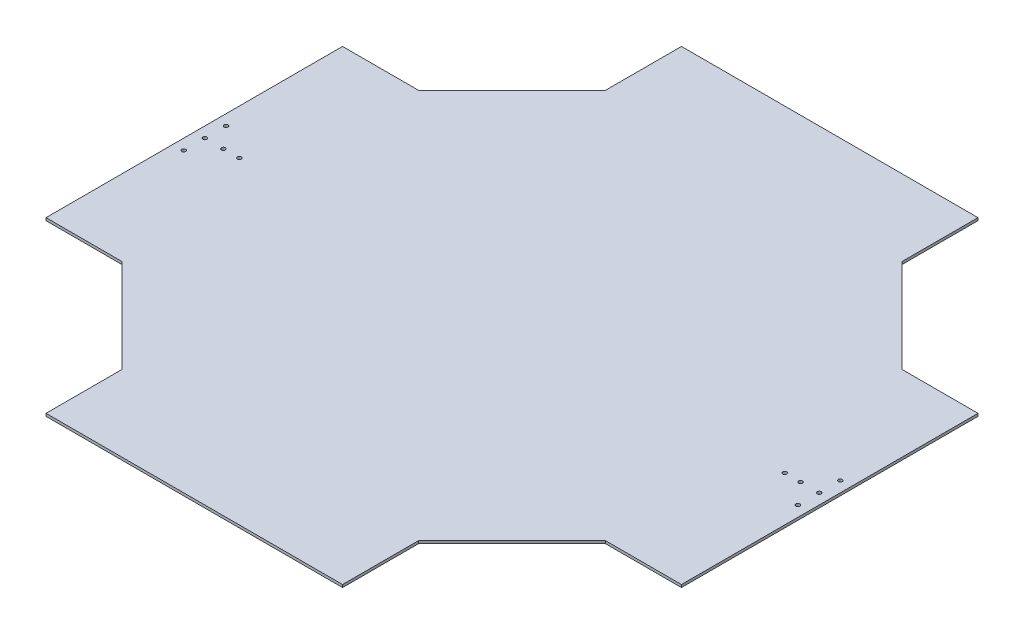
ISO-10303-21;
HEADER;
FILE_DESCRIPTION(('STEP AP214'),'2;1');
FILE_NAME('part.step','',(''),(''),'','','');
FILE_SCHEMA(('AUTOMOTIVE_DESIGN { 1 0 10303 214 1 1 1 1 }'));
ENDSEC;
DATA;
#1=APPLICATION_CONTEXT('core data for automotive mechanical design processes');
#2=APPLICATION_PROTOCOL_DEFINITION('international standard','automotive_design',2000,#1);
#3=PRODUCT_CONTEXT('',#1,'mechanical');
#4=PRODUCT('Part','Part','',(#3));
#5=PRODUCT_RELATED_PRODUCT_CATEGORY('part','',(#4));
#6=PRODUCT_DEFINITION_FORMATION('','',#4);
#7=PRODUCT_DEFINITION_CONTEXT('part definition',#1,'design');
#8=PRODUCT_DEFINITION('design','',#6,#7);
#9=PRODUCT_DEFINITION_SHAPE('','',#8);
#10=(LENGTH_UNIT() NAMED_UNIT(*) SI_UNIT(.MILLI.,.METRE.));
#11=(NAMED_UNIT(*) PLANE_ANGLE_UNIT() SI_UNIT($,.RADIAN.));
#12=(NAMED_UNIT(*) SI_UNIT($,.STERADIAN.) SOLID_ANGLE_UNIT());
#13=UNCERTAINTY_MEASURE_WITH_UNIT(LENGTH_MEASURE(1.E-05),#10,'distance_accuracy_value','');
#14=(GEOMETRIC_REPRESENTATION_CONTEXT(3) GLOBAL_UNCERTAINTY_ASSIGNED_CONTEXT((#13)) GLOBAL_UNIT_ASSIGNED_CONTEXT((#10,
#11,#12)) REPRESENTATION_CONTEXT('',''));
#15=CARTESIAN_POINT('',(0.,0.,0.));
#16=DIRECTION('',(0.,0.,1.));
#17=DIRECTION('',(1.,0.,0.));
#18=AXIS2_PLACEMENT_3D('',#15,#16,#17);
#19=CARTESIAN_POINT('',(-381.,1.5875,177.8));
#20=DIRECTION('',(1.,0.,0.));
#21=DIRECTION('',(0.,0.,-1.));
#22=AXIS2_PLACEMENT_3D('',#19,#20,#21);
#23=PLANE('',#22);
#24=DIRECTION('',(0.,0.,1.));
#25=VECTOR('',#24,1.);
#26=CARTESIAN_POINT('',(-381.,-1.5875,177.8));
#27=LINE('',#26,#25);
#28=CARTESIAN_POINT('',(-381.,-1.5875,-177.8));
#29=VERTEX_POINT('',#28);
#30=CARTESIAN_POINT('',(-381.,-1.5875,177.8));
#31=VERTEX_POINT('',#30);
#32=EDGE_CURVE('E181',#29,#31,#27,.T.);
#33=ORIENTED_EDGE('',*,*,#32,.T.);
#34=DIRECTION('',(0.,-1.,0.));
#35=VECTOR('',#34,1.);
#36=CARTESIAN_POINT('',(-381.,1.5875,177.8));
#37=LINE('',#36,#35);
#38=CARTESIAN_POINT('',(-381.,1.5875,177.8));
#39=VERTEX_POINT('',#38);
#40=EDGE_CURVE('E11',#39,#31,#37,.T.);
#41=ORIENTED_EDGE('',*,*,#40,.F.);
#42=DIRECTION('',(0.,0.,1.));
#43=VECTOR('',#42,1.);
#44=CARTESIAN_POINT('',(-381.,1.5875,177.8));
#45=LINE('',#44,#43);
#46=CARTESIAN_POINT('',(-381.,1.5875,-177.8));
#47=VERTEX_POINT('',#46);
#48=EDGE_CURVE('E212',#47,#39,#45,.T.);
#49=ORIENTED_EDGE('',*,*,#48,.F.);
#50=DIRECTION('',(0.,-1.,0.));
#51=VECTOR('',#50,1.);
#52=CARTESIAN_POINT('',(-381.,1.5875,-177.8));
#53=LINE('',#52,#51);
#54=EDGE_CURVE('E177',#47,#29,#53,.T.);
#55=ORIENTED_EDGE('',*,*,#54,.T.);
#56=EDGE_LOOP('',(#33,#41,#49,#55));
#57=FACE_BOUND('',#56,.T.);
#58=ADVANCED_FACE('F37',(#57),#23,.F.);
#59=CARTESIAN_POINT('',(-381.,1.5875,177.8));
#60=DIRECTION('',(0.,0.,-1.));
#61=DIRECTION('',(-1.,0.,0.));
#62=AXIS2_PLACEMENT_3D('',#59,#60,#61);
#63=PLANE('',#62);
#64=DIRECTION('',(1.,0.,0.));
#65=VECTOR('',#64,1.);
#66=CARTESIAN_POINT('',(-381.,-1.5875,177.8));
#67=LINE('',#66,#65);
#68=CARTESIAN_POINT('',(-289.71875,-1.5875,177.8));
#69=VERTEX_POINT('',#68);
#70=EDGE_CURVE('E184',#31,#69,#67,.T.);
#71=ORIENTED_EDGE('',*,*,#70,.T.);
#72=DIRECTION('',(0.,-1.,0.));
#73=VECTOR('',#72,1.);
#74=CARTESIAN_POINT('',(-289.71875,1.5875,177.8));
#75=LINE('',#74,#73);
#76=CARTESIAN_POINT('',(-289.71875,1.5875,177.8));
#77=VERTEX_POINT('',#76);
#78=EDGE_CURVE('E45',#77,#69,#75,.T.);
#79=ORIENTED_EDGE('',*,*,#78,.F.);
#80=DIRECTION('',(1.,0.,0.));
#81=VECTOR('',#80,1.);
#82=CARTESIAN_POINT('',(-381.,1.5875,177.8));
#83=LINE('',#82,#81);
#84=EDGE_CURVE('E120',#39,#77,#83,.T.);
#85=ORIENTED_EDGE('',*,*,#84,.F.);
#86=ORIENTED_EDGE('',*,*,#40,.T.);
#87=EDGE_LOOP('',(#71,#79,#85,#86));
#88=FACE_BOUND('',#87,.T.);
#89=ADVANCED_FACE('F312',(#88),#63,.F.);
#90=CARTESIAN_POINT('',(-289.71875,1.5875,177.8));
#91=DIRECTION('',(0.707106781186549,0.,-0.707106781186545));
#92=DIRECTION('',(-0.707106781186546,0.,-0.70710678118655));
#93=AXIS2_PLACEMENT_3D('',#90,#91,#92);
#94=PLANE('',#93);
#95=DIRECTION('',(0.707106781186546,0.,0.707106781186549));
#96=VECTOR('',#95,1.);
#97=CARTESIAN_POINT('',(-289.71875,-1.5875,177.8));
#98=LINE('',#97,#96);
#99=CARTESIAN_POINT('',(-177.8,-1.5875,289.718750000001));
#100=VERTEX_POINT('',#99);
#101=EDGE_CURVE('E187',#69,#100,#98,.T.);
#102=ORIENTED_EDGE('',*,*,#101,.T.);
#103=DIRECTION('',(0.,-1.,0.));
#104=VECTOR('',#103,1.);
#105=CARTESIAN_POINT('',(-177.8,1.5875,289.718750000001));
#106=LINE('',#105,#104);
#107=CARTESIAN_POINT('',(-177.8,1.5875,289.718750000001));
#108=VERTEX_POINT('',#107);
#109=EDGE_CURVE('E243',#108,#100,#106,.T.);
#110=ORIENTED_EDGE('',*,*,#109,.F.);
#111=DIRECTION('',(0.707106781186546,0.,0.707106781186549));
#112=VECTOR('',#111,1.);
#113=CARTESIAN_POINT('',(-289.71875,1.5875,177.8));
#114=LINE('',#113,#112);
#115=EDGE_CURVE('E251',#77,#108,#114,.T.);
#116=ORIENTED_EDGE('',*,*,#115,.F.);
#117=ORIENTED_EDGE('',*,*,#78,.T.);
#118=EDGE_LOOP('',(#102,#110,#116,#117));
#119=FACE_BOUND('',#118,.T.);
#120=ADVANCED_FACE('F249',(#119),#94,.F.);
#121=CARTESIAN_POINT('',(-177.8,1.5875,289.718750000001));
#122=DIRECTION('',(1.,0.,0.));
#123=DIRECTION('',(0.,0.,-1.));
#124=AXIS2_PLACEMENT_3D('',#121,#122,#123);
#125=PLANE('',#124);
#126=DIRECTION('',(0.,0.,1.));
#127=VECTOR('',#126,1.);
#128=CARTESIAN_POINT('',(-177.8,-1.5875,289.718750000001));
#129=LINE('',#128,#127);
#130=CARTESIAN_POINT('',(-177.8,-1.5875,381.));
#131=VERTEX_POINT('',#130);
#132=EDGE_CURVE('E189',#100,#131,#129,.T.);
#133=ORIENTED_EDGE('',*,*,#132,.T.);
#134=DIRECTION('',(0.,-1.,0.));
#135=VECTOR('',#134,1.);
#136=CARTESIAN_POINT('',(-177.8,1.5875,381.));
#137=LINE('',#136,#135);
#138=CARTESIAN_POINT('',(-177.8,1.5875,381.));
#139=VERTEX_POINT('',#138);
#140=EDGE_CURVE('E240',#139,#131,#137,.T.);
#141=ORIENTED_EDGE('',*,*,#140,.F.);
#142=DIRECTION('',(0.,0.,1.));
#143=VECTOR('',#142,1.);
#144=CARTESIAN_POINT('',(-177.8,1.5875,289.718750000001));
#145=LINE('',#144,#143);
#146=EDGE_CURVE('E269',#108,#139,#145,.T.);
#147=ORIENTED_EDGE('',*,*,#146,.F.);
#148=ORIENTED_EDGE('',*,*,#109,.T.);
#149=EDGE_LOOP('',(#133,#141,#147,#148));
#150=FACE_BOUND('',#149,.T.);
#151=ADVANCED_FACE('F260',(#150),#125,.F.);
#152=CARTESIAN_POINT('',(-177.8,1.5875,381.));
#153=DIRECTION('',(0.,0.,-1.));
#154=DIRECTION('',(-1.,0.,0.));
#155=AXIS2_PLACEMENT_3D('',#152,#153,#154);
#156=PLANE('',#155);
#157=DIRECTION('',(1.,0.,0.));
#158=VECTOR('',#157,1.);
#159=CARTESIAN_POINT('',(-177.8,-1.5875,381.));
#160=LINE('',#159,#158);
#161=CARTESIAN_POINT('',(177.8,-1.5875,381.));
#162=VERTEX_POINT('',#161);
#163=EDGE_CURVE('E191',#131,#162,#160,.T.);
#164=ORIENTED_EDGE('',*,*,#163,.T.);
#165=DIRECTION('',(0.,-1.,0.));
#166=VECTOR('',#165,1.);
#167=CARTESIAN_POINT('',(177.8,1.5875,381.));
#168=LINE('',#167,#166);
#169=CARTESIAN_POINT('',(177.8,1.5875,381.));
#170=VERTEX_POINT('',#169);
#171=EDGE_CURVE('E237',#170,#162,#168,.T.);
#172=ORIENTED_EDGE('',*,*,#171,.F.);
#173=DIRECTION('',(1.,0.,0.));
#174=VECTOR('',#173,1.);
#175=CARTESIAN_POINT('',(-177.8,1.5875,381.));
#176=LINE('',#175,#174);
#177=EDGE_CURVE('E266',#139,#170,#176,.T.);
#178=ORIENTED_EDGE('',*,*,#177,.F.);
#179=ORIENTED_EDGE('',*,*,#140,.T.);
#180=EDGE_LOOP('',(#164,#172,#178,#179));
#181=FACE_BOUND('',#180,.T.);
#182=ADVANCED_FACE('F264',(#181),#156,.F.);
#183=CARTESIAN_POINT('',(177.8,1.5875,289.718750000001));
#184=DIRECTION('',(-1.,0.,0.));
#185=DIRECTION('',(0.,0.,1.));
#186=AXIS2_PLACEMENT_3D('',#183,#184,#185);
#187=PLANE('',#186);
#188=DIRECTION('',(0.,0.,-1.));
#189=VECTOR('',#188,1.);
#190=CARTESIAN_POINT('',(177.8,-1.5875,289.718750000001));
#191=LINE('',#190,#189);
#192=CARTESIAN_POINT('',(177.8,-1.5875,289.718750000001));
#193=VERTEX_POINT('',#192);
#194=EDGE_CURVE('E193',#162,#193,#191,.T.);
#195=ORIENTED_EDGE('',*,*,#194,.T.);
#196=DIRECTION('',(0.,-1.,0.));
#197=VECTOR('',#196,1.);
#198=CARTESIAN_POINT('',(177.8,1.5875,289.718750000001));
#199=LINE('',#198,#197);
#200=CARTESIAN_POINT('',(177.8,1.5875,289.718750000001));
#201=VERTEX_POINT('',#200);
#202=EDGE_CURVE('E234',#201,#193,#199,.T.);
#203=ORIENTED_EDGE('',*,*,#202,.F.);
#204=DIRECTION('',(0.,0.,-1.));
#205=VECTOR('',#204,1.);
#206=CARTESIAN_POINT('',(177.8,1.5875,289.718750000001));
#207=LINE('',#206,#205);
#208=EDGE_CURVE('E268',#170,#201,#207,.T.);
#209=ORIENTED_EDGE('',*,*,#208,.F.);
#210=ORIENTED_EDGE('',*,*,#171,.T.);
#211=EDGE_LOOP('',(#195,#203,#209,#210));
#212=FACE_BOUND('',#211,.T.);
#213=ADVANCED_FACE('F325',(#212),#187,.F.);
#214=CARTESIAN_POINT('',(289.71875,1.5875,177.8));
#215=DIRECTION('',(-0.70710678118655,0.,-0.707106781186545));
#216=DIRECTION('',(-0.707106781186545,0.,0.70710678118655));
#217=AXIS2_PLACEMENT_3D('',#214,#215,#216);
#218=PLANE('',#217);
#219=DIRECTION('',(0.707106781186545,0.,-0.70710678118655));
#220=VECTOR('',#219,1.);
#221=CARTESIAN_POINT('',(289.71875,-1.5875,177.8));
#222=LINE('',#221,#220);
#223=CARTESIAN_POINT('',(289.71875,-1.5875,177.8));
#224=VERTEX_POINT('',#223);
#225=EDGE_CURVE('E195',#193,#224,#222,.T.);
#226=ORIENTED_EDGE('',*,*,#225,.T.);
#227=DIRECTION('',(0.,-1.,0.));
#228=VECTOR('',#227,1.);
#229=CARTESIAN_POINT('',(289.71875,1.5875,177.8));
#230=LINE('',#229,#228);
#231=CARTESIAN_POINT('',(289.71875,1.5875,177.8));
#232=VERTEX_POINT('',#231);
#233=EDGE_CURVE('E231',#232,#224,#230,.T.);
#234=ORIENTED_EDGE('',*,*,#233,.F.);
#235=DIRECTION('',(0.707106781186545,0.,-0.70710678118655));
#236=VECTOR('',#235,1.);
#237=CARTESIAN_POINT('',(289.71875,1.5875,177.8));
#238=LINE('',#237,#236);
#239=EDGE_CURVE('E271',#201,#232,#238,.T.);
#240=ORIENTED_EDGE('',*,*,#239,.F.);
#241=ORIENTED_EDGE('',*,*,#202,.T.);
#242=EDGE_LOOP('',(#226,#234,#240,#241));
#243=FACE_BOUND('',#242,.T.);
#244=ADVANCED_FACE('F328',(#243),#218,.F.);
#245=CARTESIAN_POINT('',(381.,1.5875,177.8));
#246=DIRECTION('',(0.,0.,-1.));
#247=DIRECTION('',(-1.,0.,0.));
#248=AXIS2_PLACEMENT_3D('',#245,#246,#247);
#249=PLANE('',#248);
#250=DIRECTION('',(1.,0.,0.));
#251=VECTOR('',#250,1.);
#252=CARTESIAN_POINT('',(381.,-1.5875,177.8));
#253=LINE('',#252,#251);
#254=CARTESIAN_POINT('',(381.,-1.5875,177.8));
#255=VERTEX_POINT('',#254);
#256=EDGE_CURVE('E197',#224,#255,#253,.T.);
#257=ORIENTED_EDGE('',*,*,#256,.T.);
#258=DIRECTION('',(0.,-1.,0.));
#259=VECTOR('',#258,1.);
#260=CARTESIAN_POINT('',(381.,1.5875,177.8));
#261=LINE('',#260,#259);
#262=CARTESIAN_POINT('',(381.,1.5875,177.8));
#263=VERTEX_POINT('',#262);
#264=EDGE_CURVE('E228',#263,#255,#261,.T.);
#265=ORIENTED_EDGE('',*,*,#264,.F.);
#266=DIRECTION('',(1.,0.,0.));
#267=VECTOR('',#266,1.);
#268=CARTESIAN_POINT('',(381.,1.5875,177.8));
#269=LINE('',#268,#267);
#270=EDGE_CURVE('E277',#232,#263,#269,.T.);
#271=ORIENTED_EDGE('',*,*,#270,.F.);
#272=ORIENTED_EDGE('',*,*,#233,.T.);
#273=EDGE_LOOP('',(#257,#265,#271,#272));
#274=FACE_BOUND('',#273,.T.);
#275=ADVANCED_FACE('F332',(#274),#249,.F.);
#276=CARTESIAN_POINT('',(381.,1.5875,177.8));
#277=DIRECTION('',(-1.,0.,0.));
#278=DIRECTION('',(0.,0.,1.));
#279=AXIS2_PLACEMENT_3D('',#276,#277,#278);
#280=PLANE('',#279);
#281=DIRECTION('',(0.,0.,-1.));
#282=VECTOR('',#281,1.);
#283=CARTESIAN_POINT('',(381.,-1.5875,177.8));
#284=LINE('',#283,#282);
#285=CARTESIAN_POINT('',(381.,-1.5875,-177.8));
#286=VERTEX_POINT('',#285);
#287=EDGE_CURVE('E199',#255,#286,#284,.T.);
#288=ORIENTED_EDGE('',*,*,#287,.T.);
#289=DIRECTION('',(0.,-1.,0.));
#290=VECTOR('',#289,1.);
#291=CARTESIAN_POINT('',(381.,1.5875,-177.8));
#292=LINE('',#291,#290);
#293=CARTESIAN_POINT('',(381.,1.5875,-177.8));
#294=VERTEX_POINT('',#293);
#295=EDGE_CURVE('E225',#294,#286,#292,.T.);
#296=ORIENTED_EDGE('',*,*,#295,.F.);
#297=DIRECTION('',(0.,0.,-1.));
#298=VECTOR('',#297,1.);
#299=CARTESIAN_POINT('',(381.,1.5875,177.8));
#300=LINE('',#299,#298);
#301=EDGE_CURVE('E279',#263,#294,#300,.T.);
#302=ORIENTED_EDGE('',*,*,#301,.F.);
#303=ORIENTED_EDGE('',*,*,#264,.T.);
#304=EDGE_LOOP('',(#288,#296,#302,#303));
#305=FACE_BOUND('',#304,.T.);
#306=ADVANCED_FACE('F336',(#305),#280,.F.);
#307=CARTESIAN_POINT('',(381.,1.5875,-177.8));
#308=DIRECTION('',(0.,0.,1.));
#309=DIRECTION('',(1.,0.,0.));
#310=AXIS2_PLACEMENT_3D('',#307,#308,#309);
#311=PLANE('',#310);
#312=DIRECTION('',(-1.,0.,0.));
#313=VECTOR('',#312,1.);
#314=CARTESIAN_POINT('',(381.,-1.5875,-177.8));
#315=LINE('',#314,#313);
#316=CARTESIAN_POINT('',(289.71875,-1.5875,-177.8));
#317=VERTEX_POINT('',#316);
#318=EDGE_CURVE('E201',#286,#317,#315,.T.);
#319=ORIENTED_EDGE('',*,*,#318,.T.);
#320=DIRECTION('',(0.,-1.,0.));
#321=VECTOR('',#320,1.);
#322=CARTESIAN_POINT('',(289.71875,1.5875,-177.8));
#323=LINE('',#322,#321);
#324=CARTESIAN_POINT('',(289.71875,1.5875,-177.8));
#325=VERTEX_POINT('',#324);
#326=EDGE_CURVE('E222',#325,#317,#323,.T.);
#327=ORIENTED_EDGE('',*,*,#326,.F.);
#328=DIRECTION('',(-1.,0.,0.));
#329=VECTOR('',#328,1.);
#330=CARTESIAN_POINT('',(381.,1.5875,-177.8));
#331=LINE('',#330,#329);
#332=EDGE_CURVE('E281',#294,#325,#331,.T.);
#333=ORIENTED_EDGE('',*,*,#332,.F.);
#334=ORIENTED_EDGE('',*,*,#295,.T.);
#335=EDGE_LOOP('',(#319,#327,#333,#334));
#336=FACE_BOUND('',#335,.T.);
#337=ADVANCED_FACE('F340',(#336),#311,.F.);
#338=CARTESIAN_POINT('',(289.71875,1.5875,-177.8));
#339=DIRECTION('',(-0.70710678118655,0.,0.707106781186545));
#340=DIRECTION('',(0.707106781186545,0.,0.70710678118655));
#341=AXIS2_PLACEMENT_3D('',#338,#339,#340);
#342=PLANE('',#341);
#343=DIRECTION('',(-0.707106781186545,0.,-0.70710678118655));
#344=VECTOR('',#343,1.);
#345=CARTESIAN_POINT('',(289.71875,-1.5875,-177.8));
#346=LINE('',#345,#344);
#347=CARTESIAN_POINT('',(177.8,-1.5875,-289.718750000001));
#348=VERTEX_POINT('',#347);
#349=EDGE_CURVE('E203',#317,#348,#346,.T.);
#350=ORIENTED_EDGE('',*,*,#349,.T.);
#351=DIRECTION('',(0.,-1.,0.));
#352=VECTOR('',#351,1.);
#353=CARTESIAN_POINT('',(177.8,1.5875,-289.718750000001));
#354=LINE('',#353,#352);
#355=CARTESIAN_POINT('',(177.8,1.5875,-289.718750000001));
#356=VERTEX_POINT('',#355);
#357=EDGE_CURVE('E219',#356,#348,#354,.T.);
#358=ORIENTED_EDGE('',*,*,#357,.F.);
#359=DIRECTION('',(-0.707106781186545,0.,-0.70710678118655));
#360=VECTOR('',#359,1.);
#361=CARTESIAN_POINT('',(289.71875,1.5875,-177.8));
#362=LINE('',#361,#360);
#363=EDGE_CURVE('E283',#325,#356,#362,.T.);
#364=ORIENTED_EDGE('',*,*,#363,.F.);
#365=ORIENTED_EDGE('',*,*,#326,.T.);
#366=EDGE_LOOP('',(#350,#358,#364,#365));
#367=FACE_BOUND('',#366,.T.);
#368=ADVANCED_FACE('F344',(#367),#342,.F.);
#369=CARTESIAN_POINT('',(177.8,1.5875,-289.718750000001));
#370=DIRECTION('',(-1.,0.,0.));
#371=DIRECTION('',(0.,0.,1.));
#372=AXIS2_PLACEMENT_3D('',#369,#370,#371);
#373=PLANE('',#372);
#374=DIRECTION('',(0.,0.,-1.));
#375=VECTOR('',#374,1.);
#376=CARTESIAN_POINT('',(177.8,-1.5875,-289.718750000001));
#377=LINE('',#376,#375);
#378=CARTESIAN_POINT('',(177.8,-1.5875,-381.));
#379=VERTEX_POINT('',#378);
#380=EDGE_CURVE('E205',#348,#379,#377,.T.);
#381=ORIENTED_EDGE('',*,*,#380,.T.);
#382=DIRECTION('',(0.,-1.,0.));
#383=VECTOR('',#382,1.);
#384=CARTESIAN_POINT('',(177.8,1.5875,-381.));
#385=LINE('',#384,#383);
#386=CARTESIAN_POINT('',(177.8,1.5875,-381.));
#387=VERTEX_POINT('',#386);
#388=EDGE_CURVE('E216',#387,#379,#385,.T.);
#389=ORIENTED_EDGE('',*,*,#388,.F.);
#390=DIRECTION('',(0.,0.,-1.));
#391=VECTOR('',#390,1.);
#392=CARTESIAN_POINT('',(177.8,1.5875,-289.718750000001));
#393=LINE('',#392,#391);
#394=EDGE_CURVE('E285',#356,#387,#393,.T.);
#395=ORIENTED_EDGE('',*,*,#394,.F.);
#396=ORIENTED_EDGE('',*,*,#357,.T.);
#397=EDGE_LOOP('',(#381,#389,#395,#396));
#398=FACE_BOUND('',#397,.T.);
#399=ADVANCED_FACE('F291',(#398),#373,.F.);
#400=CARTESIAN_POINT('',(-177.8,1.5875,-381.));
#401=DIRECTION('',(0.,0.,1.));
#402=DIRECTION('',(1.,0.,0.));
#403=AXIS2_PLACEMENT_3D('',#400,#401,#402);
#404=PLANE('',#403);
#405=DIRECTION('',(-1.,0.,0.));
#406=VECTOR('',#405,1.);
#407=CARTESIAN_POINT('',(-177.8,-1.5875,-381.));
#408=LINE('',#407,#406);
#409=CARTESIAN_POINT('',(-177.8,-1.5875,-381.));
#410=VERTEX_POINT('',#409);
#411=EDGE_CURVE('E207',#379,#410,#408,.T.);
#412=ORIENTED_EDGE('',*,*,#411,.T.);
#413=DIRECTION('',(0.,-1.,0.));
#414=VECTOR('',#413,1.);
#415=CARTESIAN_POINT('',(-177.8,1.5875,-381.));
#416=LINE('',#415,#414);
#417=CARTESIAN_POINT('',(-177.8,1.5875,-381.));
#418=VERTEX_POINT('',#417);
#419=EDGE_CURVE('E172',#418,#410,#416,.T.);
#420=ORIENTED_EDGE('',*,*,#419,.F.);
#421=DIRECTION('',(-1.,0.,0.));
#422=VECTOR('',#421,1.);
#423=CARTESIAN_POINT('',(-177.8,1.5875,-381.));
#424=LINE('',#423,#422);
#425=EDGE_CURVE('E163',#387,#418,#424,.T.);
#426=ORIENTED_EDGE('',*,*,#425,.F.);
#427=ORIENTED_EDGE('',*,*,#388,.T.);
#428=EDGE_LOOP('',(#412,#420,#426,#427));
#429=FACE_BOUND('',#428,.T.);
#430=ADVANCED_FACE('F295',(#429),#404,.F.);
#431=CARTESIAN_POINT('',(-177.8,1.5875,-289.718750000001));
#432=DIRECTION('',(1.,0.,0.));
#433=DIRECTION('',(0.,0.,-1.));
#434=AXIS2_PLACEMENT_3D('',#431,#432,#433);
#435=PLANE('',#434);
#436=DIRECTION('',(0.,0.,1.));
#437=VECTOR('',#436,1.);
#438=CARTESIAN_POINT('',(-177.8,-1.5875,-289.718750000001));
#439=LINE('',#438,#437);
#440=CARTESIAN_POINT('',(-177.8,-1.5875,-289.718750000001));
#441=VERTEX_POINT('',#440);
#442=EDGE_CURVE('E171',#410,#441,#439,.T.);
#443=ORIENTED_EDGE('',*,*,#442,.T.);
#444=DIRECTION('',(0.,-1.,0.));
#445=VECTOR('',#444,1.);
#446=CARTESIAN_POINT('',(-177.8,1.5875,-289.718750000001));
#447=LINE('',#446,#445);
#448=CARTESIAN_POINT('',(-177.8,1.5875,-289.718750000001));
#449=VERTEX_POINT('',#448);
#450=EDGE_CURVE('E168',#449,#441,#447,.T.);
#451=ORIENTED_EDGE('',*,*,#450,.F.);
#452=DIRECTION('',(0.,0.,1.));
#453=VECTOR('',#452,1.);
#454=CARTESIAN_POINT('',(-177.8,1.5875,-289.718750000001));
#455=LINE('',#454,#453);
#456=EDGE_CURVE('E157',#418,#449,#455,.T.);
#457=ORIENTED_EDGE('',*,*,#456,.F.);
#458=ORIENTED_EDGE('',*,*,#419,.T.);
#459=EDGE_LOOP('',(#443,#451,#457,#458));
#460=FACE_BOUND('',#459,.T.);
#461=ADVANCED_FACE('F169',(#460),#435,.F.);
#462=CARTESIAN_POINT('',(-289.71875,1.5875,-177.8));
#463=DIRECTION('',(0.70710678118655,0.,0.707106781186545));
#464=DIRECTION('',(0.707106781186545,0.,-0.70710678118655));
#465=AXIS2_PLACEMENT_3D('',#462,#463,#464);
#466=PLANE('',#465);
#467=DIRECTION('',(-0.707106781186545,0.,0.70710678118655));
#468=VECTOR('',#467,1.);
#469=CARTESIAN_POINT('',(-289.71875,-1.5875,-177.8));
#470=LINE('',#469,#468);
#471=CARTESIAN_POINT('',(-289.71875,-1.5875,-177.8));
#472=VERTEX_POINT('',#471);
#473=EDGE_CURVE('E106',#441,#472,#470,.T.);
#474=ORIENTED_EDGE('',*,*,#473,.T.);
#475=DIRECTION('',(0.,-1.,0.));
#476=VECTOR('',#475,1.);
#477=CARTESIAN_POINT('',(-289.71875,1.5875,-177.8));
#478=LINE('',#477,#476);
#479=CARTESIAN_POINT('',(-289.71875,1.5875,-177.8));
#480=VERTEX_POINT('',#479);
#481=EDGE_CURVE('E173',#480,#472,#478,.T.);
#482=ORIENTED_EDGE('',*,*,#481,.F.);
#483=DIRECTION('',(-0.707106781186545,0.,0.70710678118655));
#484=VECTOR('',#483,1.);
#485=CARTESIAN_POINT('',(-289.71875,1.5875,-177.8));
#486=LINE('',#485,#484);
#487=EDGE_CURVE('E161',#449,#480,#486,.T.);
#488=ORIENTED_EDGE('',*,*,#487,.F.);
#489=ORIENTED_EDGE('',*,*,#450,.T.);
#490=EDGE_LOOP('',(#474,#482,#488,#489));
#491=FACE_BOUND('',#490,.T.);
#492=ADVANCED_FACE('F175',(#491),#466,.F.);
#493=CARTESIAN_POINT('',(-381.,1.5875,-177.8));
#494=DIRECTION('',(0.,0.,1.));
#495=DIRECTION('',(1.,0.,0.));
#496=AXIS2_PLACEMENT_3D('',#493,#494,#495);
#497=PLANE('',#496);
#498=DIRECTION('',(-1.,0.,0.));
#499=VECTOR('',#498,1.);
#500=CARTESIAN_POINT('',(-381.,-1.5875,-177.8));
#501=LINE('',#500,#499);
#502=EDGE_CURVE('E112',#472,#29,#501,.T.);
#503=ORIENTED_EDGE('',*,*,#502,.T.);
#504=ORIENTED_EDGE('',*,*,#54,.F.);
#505=DIRECTION('',(-1.,0.,0.));
#506=VECTOR('',#505,1.);
#507=CARTESIAN_POINT('',(-381.,1.5875,-177.8));
#508=LINE('',#507,#506);
#509=EDGE_CURVE('E53',#480,#47,#508,.T.);
#510=ORIENTED_EDGE('',*,*,#509,.F.);
#511=ORIENTED_EDGE('',*,*,#481,.T.);
#512=EDGE_LOOP('',(#503,#504,#510,#511));
#513=FACE_BOUND('',#512,.T.);
#514=ADVANCED_FACE('F299',(#513),#497,.F.);
#515=CARTESIAN_POINT('',(0.,1.5875,0.));
#516=DIRECTION('',(0.,-1.,0.));
#517=DIRECTION('',(0.,0.,-1.));
#518=AXIS2_PLACEMENT_3D('',#515,#516,#517);
#519=PLANE('',#518);
#520=CARTESIAN_POINT('',(-327.025,1.5875,0.));
#521=DIRECTION('',(0.,1.,0.));
#522=DIRECTION('',(0.,0.,1.));
#523=AXIS2_PLACEMENT_3D('',#520,#521,#522);
#524=CIRCLE('',#523,2.38125000000001);
#525=CARTESIAN_POINT('',(-327.025,1.5875,2.38125000000005));
#526=VERTEX_POINT('',#525);
#527=EDGE_CURVE('E619',#526,#526,#524,.T.);
#528=ORIENTED_EDGE('',*,*,#527,.F.);
#529=EDGE_LOOP('',(#528));
#530=FACE_BOUND('',#529,.T.);
#531=CARTESIAN_POINT('',(346.075,1.5875,0.));
#532=DIRECTION('',(0.,1.,0.));
#533=DIRECTION('',(0.,0.,-1.));
#534=AXIS2_PLACEMENT_3D('',#531,#532,#533);
#535=CIRCLE('',#534,2.38125000000001);
#536=CARTESIAN_POINT('',(346.075,1.5875,-2.38124999999996));
#537=VERTEX_POINT('',#536);
#538=EDGE_CURVE('E623',#537,#537,#535,.T.);
#539=ORIENTED_EDGE('',*,*,#538,.F.);
#540=EDGE_LOOP('',(#539));
#541=FACE_BOUND('',#540,.T.);
#542=CARTESIAN_POINT('',(368.3,1.5875,0.));
#543=DIRECTION('',(0.,1.,0.));
#544=DIRECTION('',(0.,0.,-1.));
#545=AXIS2_PLACEMENT_3D('',#542,#543,#544);
#546=CIRCLE('',#545,2.38125000000001);
#547=CARTESIAN_POINT('',(368.3,1.5875,-2.38124999999996));
#548=VERTEX_POINT('',#547);
#549=EDGE_CURVE('E673',#548,#548,#546,.T.);
#550=ORIENTED_EDGE('',*,*,#549,.F.);
#551=EDGE_LOOP('',(#550));
#552=FACE_BOUND('',#551,.T.);
#553=CARTESIAN_POINT('',(368.3,1.5875,-25.4));
#554=DIRECTION('',(0.,1.,0.));
#555=DIRECTION('',(0.,0.,-1.));
#556=AXIS2_PLACEMENT_3D('',#553,#554,#555);
#557=CIRCLE('',#556,2.38125000000001);
#558=CARTESIAN_POINT('',(368.3,1.5875,-27.78125));
#559=VERTEX_POINT('',#558);
#560=EDGE_CURVE('E654',#559,#559,#557,.T.);
#561=ORIENTED_EDGE('',*,*,#560,.F.);
#562=EDGE_LOOP('',(#561));
#563=FACE_BOUND('',#562,.T.);
#564=CARTESIAN_POINT('',(368.3,1.5875,25.4));
#565=DIRECTION('',(0.,1.,0.));
#566=DIRECTION('',(0.,0.,-1.));
#567=AXIS2_PLACEMENT_3D('',#564,#565,#566);
#568=CIRCLE('',#567,2.38125000000001);
#569=CARTESIAN_POINT('',(368.3,1.5875,23.01875));
#570=VERTEX_POINT('',#569);
#571=EDGE_CURVE('E648',#570,#570,#568,.T.);
#572=ORIENTED_EDGE('',*,*,#571,.F.);
#573=EDGE_LOOP('',(#572));
#574=FACE_BOUND('',#573,.T.);
#575=CARTESIAN_POINT('',(-368.3,1.5875,25.4));
#576=DIRECTION('',(0.,1.,0.));
#577=DIRECTION('',(0.,0.,1.));
#578=AXIS2_PLACEMENT_3D('',#575,#576,#577);
#579=CIRCLE('',#578,2.38125000000001);
#580=CARTESIAN_POINT('',(-368.3,1.5875,27.78125));
#581=VERTEX_POINT('',#580);
#582=EDGE_CURVE('E642',#581,#581,#579,.T.);
#583=ORIENTED_EDGE('',*,*,#582,.F.);
#584=EDGE_LOOP('',(#583));
#585=FACE_BOUND('',#584,.T.);
#586=CARTESIAN_POINT('',(-368.3,1.5875,-25.4));
#587=DIRECTION('',(0.,1.,0.));
#588=DIRECTION('',(0.,0.,1.));
#589=AXIS2_PLACEMENT_3D('',#586,#587,#588);
#590=CIRCLE('',#589,2.38125000000001);
#591=CARTESIAN_POINT('',(-368.3,1.5875,-23.0187499999999));
#592=VERTEX_POINT('',#591);
#593=EDGE_CURVE('E636',#592,#592,#590,.T.);
#594=ORIENTED_EDGE('',*,*,#593,.F.);
#595=EDGE_LOOP('',(#594));
#596=FACE_BOUND('',#595,.T.);
#597=CARTESIAN_POINT('',(-368.3,1.5875,0.));
#598=DIRECTION('',(0.,1.,0.));
#599=DIRECTION('',(0.,0.,1.));
#600=AXIS2_PLACEMENT_3D('',#597,#598,#599);
#601=CIRCLE('',#600,2.38125000000001);
#602=CARTESIAN_POINT('',(-368.3,1.5875,2.38125000000005));
#603=VERTEX_POINT('',#602);
#604=EDGE_CURVE('E629',#603,#603,#601,.T.);
#605=ORIENTED_EDGE('',*,*,#604,.F.);
#606=EDGE_LOOP('',(#605));
#607=FACE_BOUND('',#606,.T.);
#608=CARTESIAN_POINT('',(327.025,1.5875,0.));
#609=DIRECTION('',(0.,1.,0.));
#610=DIRECTION('',(0.,0.,1.));
#611=AXIS2_PLACEMENT_3D('',#608,#609,#610);
#612=CIRCLE('',#611,2.38125000000001);
#613=CARTESIAN_POINT('',(327.025,1.5875,2.38124999999997));
#614=VERTEX_POINT('',#613);
#615=EDGE_CURVE('E625',#614,#614,#612,.T.);
#616=ORIENTED_EDGE('',*,*,#615,.F.);
#617=EDGE_LOOP('',(#616));
#618=FACE_BOUND('',#617,.T.);
#619=CARTESIAN_POINT('',(-346.075,1.5875,0.));
#620=DIRECTION('',(0.,1.,0.));
#621=DIRECTION('',(0.,0.,1.));
#622=AXIS2_PLACEMENT_3D('',#619,#620,#621);
#623=CIRCLE('',#622,2.38125000000001);
#624=CARTESIAN_POINT('',(-346.075,1.5875,2.38125000000005));
#625=VERTEX_POINT('',#624);
#626=EDGE_CURVE('E632',#625,#625,#623,.T.);
#627=ORIENTED_EDGE('',*,*,#626,.F.);
#628=EDGE_LOOP('',(#627));
#629=FACE_BOUND('',#628,.T.);
#630=ORIENTED_EDGE('',*,*,#48,.T.);
#631=ORIENTED_EDGE('',*,*,#84,.T.);
#632=ORIENTED_EDGE('',*,*,#115,.T.);
#633=ORIENTED_EDGE('',*,*,#146,.T.);
#634=ORIENTED_EDGE('',*,*,#177,.T.);
#635=ORIENTED_EDGE('',*,*,#208,.T.);
#636=ORIENTED_EDGE('',*,*,#239,.T.);
#637=ORIENTED_EDGE('',*,*,#270,.T.);
#638=ORIENTED_EDGE('',*,*,#301,.T.);
#639=ORIENTED_EDGE('',*,*,#332,.T.);
#640=ORIENTED_EDGE('',*,*,#363,.T.);
#641=ORIENTED_EDGE('',*,*,#394,.T.);
#642=ORIENTED_EDGE('',*,*,#425,.T.);
#643=ORIENTED_EDGE('',*,*,#456,.T.);
#644=ORIENTED_EDGE('',*,*,#487,.T.);
#645=ORIENTED_EDGE('',*,*,#509,.T.);
#646=EDGE_LOOP('',(#630,#631,#632,#633,#634,#635,#636,#637,#638,#639,#640,#641,#642,#643,#644,#645));
#647=FACE_BOUND('',#646,.T.);
#648=ADVANCED_FACE('F159',(#530,#541,#552,#563,#574,#585,#596,#607,#618,#629,#647),#519,.F.);
#649=CARTESIAN_POINT('',(0.,-1.5875,0.));
#650=DIRECTION('',(0.,-1.,0.));
#651=DIRECTION('',(0.,0.,-1.));
#652=AXIS2_PLACEMENT_3D('',#649,#650,#651);
#653=PLANE('',#652);
#654=CARTESIAN_POINT('',(-327.025,-1.5875,0.));
#655=DIRECTION('',(0.,1.,0.));
#656=DIRECTION('',(0.,0.,1.));
#657=AXIS2_PLACEMENT_3D('',#654,#655,#656);
#658=CIRCLE('',#657,2.38125000000001);
#659=CARTESIAN_POINT('',(-327.025,-1.5875,2.38125000000005));
#660=VERTEX_POINT('',#659);
#661=EDGE_CURVE('E616',#660,#660,#658,.T.);
#662=ORIENTED_EDGE('',*,*,#661,.T.);
#663=EDGE_LOOP('',(#662));
#664=FACE_BOUND('',#663,.T.);
#665=CARTESIAN_POINT('',(346.075,-1.5875,0.));
#666=DIRECTION('',(0.,1.,0.));
#667=DIRECTION('',(0.,0.,-1.));
#668=AXIS2_PLACEMENT_3D('',#665,#666,#667);
#669=CIRCLE('',#668,2.38125000000001);
#670=CARTESIAN_POINT('',(346.075,-1.5875,-2.38124999999996));
#671=VERTEX_POINT('',#670);
#672=EDGE_CURVE('E620',#671,#671,#669,.T.);
#673=ORIENTED_EDGE('',*,*,#672,.T.);
#674=EDGE_LOOP('',(#673));
#675=FACE_BOUND('',#674,.T.);
#676=CARTESIAN_POINT('',(368.3,-1.5875,0.));
#677=DIRECTION('',(0.,1.,0.));
#678=DIRECTION('',(0.,0.,-1.));
#679=AXIS2_PLACEMENT_3D('',#676,#677,#678);
#680=CIRCLE('',#679,2.38125000000001);
#681=CARTESIAN_POINT('',(368.3,-1.5875,-2.38124999999996));
#682=VERTEX_POINT('',#681);
#683=EDGE_CURVE('E681',#682,#682,#680,.T.);
#684=ORIENTED_EDGE('',*,*,#683,.T.);
#685=EDGE_LOOP('',(#684));
#686=FACE_BOUND('',#685,.T.);
#687=CARTESIAN_POINT('',(368.3,-1.5875,-25.4));
#688=DIRECTION('',(0.,1.,0.));
#689=DIRECTION('',(0.,0.,-1.));
#690=AXIS2_PLACEMENT_3D('',#687,#688,#689);
#691=CIRCLE('',#690,2.38125000000001);
#692=CARTESIAN_POINT('',(368.3,-1.5875,-27.78125));
#693=VERTEX_POINT('',#692);
#694=EDGE_CURVE('E668',#693,#693,#691,.T.);
#695=ORIENTED_EDGE('',*,*,#694,.T.);
#696=EDGE_LOOP('',(#695));
#697=FACE_BOUND('',#696,.T.);
#698=CARTESIAN_POINT('',(368.3,-1.5875,25.4));
#699=DIRECTION('',(0.,1.,0.));
#700=DIRECTION('',(0.,0.,-1.));
#701=AXIS2_PLACEMENT_3D('',#698,#699,#700);
#702=CIRCLE('',#701,2.38125000000001);
#703=CARTESIAN_POINT('',(368.3,-1.5875,23.01875));
#704=VERTEX_POINT('',#703);
#705=EDGE_CURVE('E651',#704,#704,#702,.T.);
#706=ORIENTED_EDGE('',*,*,#705,.T.);
#707=EDGE_LOOP('',(#706));
#708=FACE_BOUND('',#707,.T.);
#709=CARTESIAN_POINT('',(-368.3,-1.5875,25.4));
#710=DIRECTION('',(0.,1.,0.));
#711=DIRECTION('',(0.,0.,1.));
#712=AXIS2_PLACEMENT_3D('',#709,#710,#711);
#713=CIRCLE('',#712,2.38125000000001);
#714=CARTESIAN_POINT('',(-368.3,-1.5875,27.78125));
#715=VERTEX_POINT('',#714);
#716=EDGE_CURVE('E645',#715,#715,#713,.T.);
#717=ORIENTED_EDGE('',*,*,#716,.T.);
#718=EDGE_LOOP('',(#717));
#719=FACE_BOUND('',#718,.T.);
#720=CARTESIAN_POINT('',(-368.3,-1.5875,-25.4));
#721=DIRECTION('',(0.,1.,0.));
#722=DIRECTION('',(0.,0.,1.));
#723=AXIS2_PLACEMENT_3D('',#720,#721,#722);
#724=CIRCLE('',#723,2.38125000000001);
#725=CARTESIAN_POINT('',(-368.3,-1.5875,-23.0187499999999));
#726=VERTEX_POINT('',#725);
#727=EDGE_CURVE('E639',#726,#726,#724,.T.);
#728=ORIENTED_EDGE('',*,*,#727,.T.);
#729=EDGE_LOOP('',(#728));
#730=FACE_BOUND('',#729,.T.);
#731=CARTESIAN_POINT('',(-368.3,-1.5875,0.));
#732=DIRECTION('',(0.,1.,0.));
#733=DIRECTION('',(0.,0.,1.));
#734=AXIS2_PLACEMENT_3D('',#731,#732,#733);
#735=CIRCLE('',#734,2.38125000000001);
#736=CARTESIAN_POINT('',(-368.3,-1.5875,2.38125000000005));
#737=VERTEX_POINT('',#736);
#738=EDGE_CURVE('E633',#737,#737,#735,.T.);
#739=ORIENTED_EDGE('',*,*,#738,.T.);
#740=EDGE_LOOP('',(#739));
#741=FACE_BOUND('',#740,.T.);
#742=CARTESIAN_POINT('',(327.025,-1.5875,0.));
#743=DIRECTION('',(0.,1.,0.));
#744=DIRECTION('',(0.,0.,1.));
#745=AXIS2_PLACEMENT_3D('',#742,#743,#744);
#746=CIRCLE('',#745,2.38125000000001);
#747=CARTESIAN_POINT('',(327.025,-1.5875,2.38124999999997));
#748=VERTEX_POINT('',#747);
#749=EDGE_CURVE('E676',#748,#748,#746,.T.);
#750=ORIENTED_EDGE('',*,*,#749,.T.);
#751=EDGE_LOOP('',(#750));
#752=FACE_BOUND('',#751,.T.);
#753=CARTESIAN_POINT('',(-346.075,-1.5875,0.));
#754=DIRECTION('',(0.,1.,0.));
#755=DIRECTION('',(0.,0.,1.));
#756=AXIS2_PLACEMENT_3D('',#753,#754,#755);
#757=CIRCLE('',#756,2.38125000000001);
#758=CARTESIAN_POINT('',(-346.075,-1.5875,2.38125000000005));
#759=VERTEX_POINT('',#758);
#760=EDGE_CURVE('E185',#759,#759,#757,.T.);
#761=ORIENTED_EDGE('',*,*,#760,.T.);
#762=EDGE_LOOP('',(#761));
#763=FACE_BOUND('',#762,.T.);
#764=ORIENTED_EDGE('',*,*,#32,.F.);
#765=ORIENTED_EDGE('',*,*,#502,.F.);
#766=ORIENTED_EDGE('',*,*,#473,.F.);
#767=ORIENTED_EDGE('',*,*,#442,.F.);
#768=ORIENTED_EDGE('',*,*,#411,.F.);
#769=ORIENTED_EDGE('',*,*,#380,.F.);
#770=ORIENTED_EDGE('',*,*,#349,.F.);
#771=ORIENTED_EDGE('',*,*,#318,.F.);
#772=ORIENTED_EDGE('',*,*,#287,.F.);
#773=ORIENTED_EDGE('',*,*,#256,.F.);
#774=ORIENTED_EDGE('',*,*,#225,.F.);
#775=ORIENTED_EDGE('',*,*,#194,.F.);
#776=ORIENTED_EDGE('',*,*,#163,.F.);
#777=ORIENTED_EDGE('',*,*,#132,.F.);
#778=ORIENTED_EDGE('',*,*,#101,.F.);
#779=ORIENTED_EDGE('',*,*,#70,.F.);
#780=EDGE_LOOP('',(#764,#765,#766,#767,#768,#769,#770,#771,#772,#773,#774,#775,#776,#777,#778,#779));
#781=FACE_BOUND('',#780,.T.);
#782=ADVANCED_FACE('F255',(#664,#675,#686,#697,#708,#719,#730,#741,#752,#763,#781),#653,.T.);
#783=CARTESIAN_POINT('',(-346.075,-1.5875,0.));
#784=DIRECTION('',(0.,1.,0.));
#785=DIRECTION('',(0.,0.,1.));
#786=AXIS2_PLACEMENT_3D('',#783,#784,#785);
#787=CYLINDRICAL_SURFACE('',#786,2.38125000000001);
#788=ORIENTED_EDGE('',*,*,#760,.F.);
#789=EDGE_LOOP('',(#788));
#790=FACE_BOUND('',#789,.T.);
#791=ORIENTED_EDGE('',*,*,#626,.T.);
#792=EDGE_LOOP('',(#791));
#793=FACE_BOUND('',#792,.T.);
#794=ADVANCED_FACE('F379',(#790,#793),#787,.F.);
#795=CARTESIAN_POINT('',(327.025,-1.5875,0.));
#796=DIRECTION('',(0.,1.,0.));
#797=DIRECTION('',(0.,0.,1.));
#798=AXIS2_PLACEMENT_3D('',#795,#796,#797);
#799=CYLINDRICAL_SURFACE('',#798,2.38125000000001);
#800=ORIENTED_EDGE('',*,*,#749,.F.);
#801=EDGE_LOOP('',(#800));
#802=FACE_BOUND('',#801,.T.);
#803=ORIENTED_EDGE('',*,*,#615,.T.);
#804=EDGE_LOOP('',(#803));
#805=FACE_BOUND('',#804,.T.);
#806=ADVANCED_FACE('F387',(#802,#805),#799,.F.);
#807=CARTESIAN_POINT('',(-368.3,-1.5875,0.));
#808=DIRECTION('',(0.,1.,0.));
#809=DIRECTION('',(0.,0.,1.));
#810=AXIS2_PLACEMENT_3D('',#807,#808,#809);
#811=CYLINDRICAL_SURFACE('',#810,2.38125000000001);
#812=ORIENTED_EDGE('',*,*,#738,.F.);
#813=EDGE_LOOP('',(#812));
#814=FACE_BOUND('',#813,.T.);
#815=ORIENTED_EDGE('',*,*,#604,.T.);
#816=EDGE_LOOP('',(#815));
#817=FACE_BOUND('',#816,.T.);
#818=ADVANCED_FACE('F398',(#814,#817),#811,.F.);
#819=CARTESIAN_POINT('',(-368.3,-1.5875,-25.4));
#820=DIRECTION('',(0.,1.,0.));
#821=DIRECTION('',(0.,0.,1.));
#822=AXIS2_PLACEMENT_3D('',#819,#820,#821);
#823=CYLINDRICAL_SURFACE('',#822,2.38125000000001);
#824=ORIENTED_EDGE('',*,*,#727,.F.);
#825=EDGE_LOOP('',(#824));
#826=FACE_BOUND('',#825,.T.);
#827=ORIENTED_EDGE('',*,*,#593,.T.);
#828=EDGE_LOOP('',(#827));
#829=FACE_BOUND('',#828,.T.);
#830=ADVANCED_FACE('F409',(#826,#829),#823,.F.);
#831=CARTESIAN_POINT('',(-368.3,-1.5875,25.4));
#832=DIRECTION('',(0.,1.,0.));
#833=DIRECTION('',(0.,0.,1.));
#834=AXIS2_PLACEMENT_3D('',#831,#832,#833);
#835=CYLINDRICAL_SURFACE('',#834,2.38125000000001);
#836=ORIENTED_EDGE('',*,*,#716,.F.);
#837=EDGE_LOOP('',(#836));
#838=FACE_BOUND('',#837,.T.);
#839=ORIENTED_EDGE('',*,*,#582,.T.);
#840=EDGE_LOOP('',(#839));
#841=FACE_BOUND('',#840,.T.);
#842=ADVANCED_FACE('F420',(#838,#841),#835,.F.);
#843=CARTESIAN_POINT('',(368.3,-1.5875,25.4));
#844=DIRECTION('',(0.,1.,0.));
#845=DIRECTION('',(0.,0.,1.));
#846=AXIS2_PLACEMENT_3D('',#843,#844,#845);
#847=CYLINDRICAL_SURFACE('',#846,2.38125000000001);
#848=ORIENTED_EDGE('',*,*,#705,.F.);
#849=EDGE_LOOP('',(#848));
#850=FACE_BOUND('',#849,.T.);
#851=ORIENTED_EDGE('',*,*,#571,.T.);
#852=EDGE_LOOP('',(#851));
#853=FACE_BOUND('',#852,.T.);
#854=ADVANCED_FACE('F431',(#850,#853),#847,.F.);
#855=CARTESIAN_POINT('',(368.3,-1.5875,-25.4));
#856=DIRECTION('',(0.,1.,0.));
#857=DIRECTION('',(0.,0.,1.));
#858=AXIS2_PLACEMENT_3D('',#855,#856,#857);
#859=CYLINDRICAL_SURFACE('',#858,2.38125000000001);
#860=ORIENTED_EDGE('',*,*,#694,.F.);
#861=EDGE_LOOP('',(#860));
#862=FACE_BOUND('',#861,.T.);
#863=ORIENTED_EDGE('',*,*,#560,.T.);
#864=EDGE_LOOP('',(#863));
#865=FACE_BOUND('',#864,.T.);
#866=ADVANCED_FACE('F442',(#862,#865),#859,.F.);
#867=CARTESIAN_POINT('',(368.3,-1.5875,0.));
#868=DIRECTION('',(0.,1.,0.));
#869=DIRECTION('',(0.,0.,1.));
#870=AXIS2_PLACEMENT_3D('',#867,#868,#869);
#871=CYLINDRICAL_SURFACE('',#870,2.38125000000001);
#872=ORIENTED_EDGE('',*,*,#683,.F.);
#873=EDGE_LOOP('',(#872));
#874=FACE_BOUND('',#873,.T.);
#875=ORIENTED_EDGE('',*,*,#549,.T.);
#876=EDGE_LOOP('',(#875));
#877=FACE_BOUND('',#876,.T.);
#878=ADVANCED_FACE('F453',(#874,#877),#871,.F.);
#879=CARTESIAN_POINT('',(346.075,-1.5875,0.));
#880=DIRECTION('',(0.,1.,0.));
#881=DIRECTION('',(0.,0.,1.));
#882=AXIS2_PLACEMENT_3D('',#879,#880,#881);
#883=CYLINDRICAL_SURFACE('',#882,2.38125000000001);
#884=ORIENTED_EDGE('',*,*,#672,.F.);
#885=EDGE_LOOP('',(#884));
#886=FACE_BOUND('',#885,.T.);
#887=ORIENTED_EDGE('',*,*,#538,.T.);
#888=EDGE_LOOP('',(#887));
#889=FACE_BOUND('',#888,.T.);
#890=ADVANCED_FACE('F464',(#886,#889),#883,.F.);
#891=CARTESIAN_POINT('',(-327.025,-1.5875,0.));
#892=DIRECTION('',(0.,1.,0.));
#893=DIRECTION('',(0.,0.,1.));
#894=AXIS2_PLACEMENT_3D('',#891,#892,#893);
#895=CYLINDRICAL_SURFACE('',#894,2.38125000000001);
#896=ORIENTED_EDGE('',*,*,#661,.F.);
#897=EDGE_LOOP('',(#896));
#898=FACE_BOUND('',#897,.T.);
#899=ORIENTED_EDGE('',*,*,#527,.T.);
#900=EDGE_LOOP('',(#899));
#901=FACE_BOUND('',#900,.T.);
#902=ADVANCED_FACE('F475',(#898,#901),#895,.F.);
#903=CLOSED_SHELL('',(#58,#89,#120,#151,#182,#213,#244,#275,#306,#337,#368,#399,#430,#461,#492,
#514,#648,#782,#794,#806,#818,#830,#842,#854,#866,#878,#890,#902));
#904=MANIFOLD_SOLID_BREP('B2',#903);
#905=ADVANCED_BREP_SHAPE_REPRESENTATION('',(#18,#904),#14);
#906=SHAPE_DEFINITION_REPRESENTATION(#9,#905);
ENDSEC;
END-ISO-10303-21;
